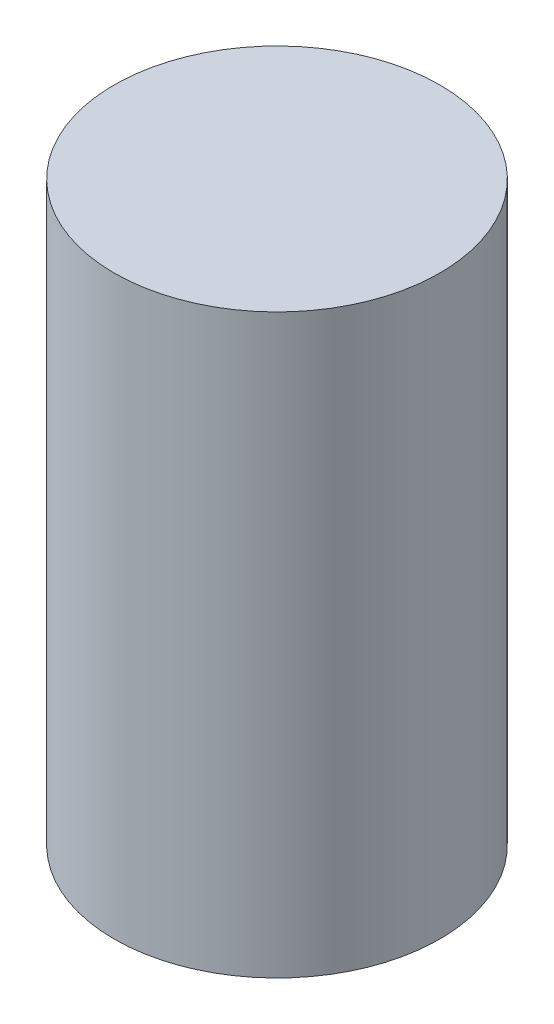
ISO-10303-21;
HEADER;
FILE_DESCRIPTION(('STEP AP214'),'2;1');
FILE_NAME('part.step','',(''),(''),'','','');
FILE_SCHEMA(('AUTOMOTIVE_DESIGN { 1 0 10303 214 1 1 1 1 }'));
ENDSEC;
DATA;
#1=APPLICATION_CONTEXT('core data for automotive mechanical design processes');
#2=APPLICATION_PROTOCOL_DEFINITION('international standard','automotive_design',2000,#1);
#3=PRODUCT_CONTEXT('',#1,'mechanical');
#4=PRODUCT('Part','Part','',(#3));
#5=PRODUCT_RELATED_PRODUCT_CATEGORY('part','',(#4));
#6=PRODUCT_DEFINITION_FORMATION('','',#4);
#7=PRODUCT_DEFINITION_CONTEXT('part definition',#1,'design');
#8=PRODUCT_DEFINITION('design','',#6,#7);
#9=PRODUCT_DEFINITION_SHAPE('','',#8);
#10=(LENGTH_UNIT() NAMED_UNIT(*) SI_UNIT(.MILLI.,.METRE.));
#11=(NAMED_UNIT(*) PLANE_ANGLE_UNIT() SI_UNIT($,.RADIAN.));
#12=(NAMED_UNIT(*) SI_UNIT($,.STERADIAN.) SOLID_ANGLE_UNIT());
#13=UNCERTAINTY_MEASURE_WITH_UNIT(LENGTH_MEASURE(1.E-05),#10,'distance_accuracy_value','');
#14=(GEOMETRIC_REPRESENTATION_CONTEXT(3) GLOBAL_UNCERTAINTY_ASSIGNED_CONTEXT((#13)) GLOBAL_UNIT_ASSIGNED_CONTEXT((#10,
#11,#12)) REPRESENTATION_CONTEXT('',''));
#15=CARTESIAN_POINT('',(0.,0.,0.));
#16=DIRECTION('',(0.,0.,1.));
#17=DIRECTION('',(1.,0.,0.));
#18=AXIS2_PLACEMENT_3D('',#15,#16,#17);
#19=CARTESIAN_POINT('',(0.,69.5,0.));
#20=DIRECTION('',(0.,-1.,0.));
#21=DIRECTION('',(0.,0.,-1.));
#22=AXIS2_PLACEMENT_3D('',#19,#20,#21);
#23=CYLINDRICAL_SURFACE('',#22,19.625);
#24=CARTESIAN_POINT('',(0.,69.5,0.));
#25=DIRECTION('',(0.,1.,0.));
#26=DIRECTION('',(0.,0.,1.));
#27=AXIS2_PLACEMENT_3D('',#24,#25,#26);
#28=CIRCLE('',#27,19.625);
#29=CARTESIAN_POINT('',(0.,69.5,19.625));
#30=VERTEX_POINT('',#29);
#31=EDGE_CURVE('E11',#30,#30,#28,.T.);
#32=ORIENTED_EDGE('',*,*,#31,.F.);
#33=EDGE_LOOP('',(#32));
#34=FACE_BOUND('',#33,.T.);
#35=CARTESIAN_POINT('',(0.,0.,0.));
#36=DIRECTION('',(0.,1.,0.));
#37=DIRECTION('',(0.,0.,1.));
#38=AXIS2_PLACEMENT_3D('',#35,#36,#37);
#39=CIRCLE('',#38,19.625);
#40=CARTESIAN_POINT('',(0.,0.,19.625));
#41=VERTEX_POINT('',#40);
#42=EDGE_CURVE('E41',#41,#41,#39,.T.);
#43=ORIENTED_EDGE('',*,*,#42,.T.);
#44=EDGE_LOOP('',(#43));
#45=FACE_BOUND('',#44,.T.);
#46=ADVANCED_FACE('F38',(#34,#45),#23,.T.);
#47=CARTESIAN_POINT('',(0.,69.5,0.));
#48=DIRECTION('',(0.,1.,0.));
#49=DIRECTION('',(0.,0.,1.));
#50=AXIS2_PLACEMENT_3D('',#47,#48,#49);
#51=PLANE('',#50);
#52=ORIENTED_EDGE('',*,*,#31,.T.);
#53=EDGE_LOOP('',(#52));
#54=FACE_BOUND('',#53,.T.);
#55=ADVANCED_FACE('F67',(#54),#51,.T.);
#56=CARTESIAN_POINT('',(0.,0.,0.));
#57=DIRECTION('',(0.,1.,0.));
#58=DIRECTION('',(0.,0.,1.));
#59=AXIS2_PLACEMENT_3D('',#56,#57,#58);
#60=PLANE('',#59);
#61=CARTESIAN_POINT('',(0.,0.,0.));
#62=DIRECTION('',(0.,-1.,0.));
#63=DIRECTION('',(0.,0.,-1.));
#64=AXIS2_PLACEMENT_3D('',#61,#62,#63);
#65=CIRCLE('',#64,2.09999999999999);
#66=CARTESIAN_POINT('',(0.,0.,-2.09999999999999));
#67=VERTEX_POINT('',#66);
#68=EDGE_CURVE('E57',#67,#67,#65,.T.);
#69=ORIENTED_EDGE('',*,*,#68,.F.);
#70=EDGE_LOOP('',(#69));
#71=FACE_BOUND('',#70,.T.);
#72=ORIENTED_EDGE('',*,*,#42,.F.);
#73=EDGE_LOOP('',(#72));
#74=FACE_BOUND('',#73,.T.);
#75=ADVANCED_FACE('F51',(#71,#74),#60,.F.);
#76=CARTESIAN_POINT('',(0.,14.,0.));
#77=DIRECTION('',(0.,-1.,0.));
#78=DIRECTION('',(0.,0.,-1.));
#79=AXIS2_PLACEMENT_3D('',#76,#77,#78);
#80=CONICAL_SURFACE('',#79,2.09999999999999,1.02974425867665);
#81=CARTESIAN_POINT('',(0.,15.2618072999579,0.));
#82=VERTEX_POINT('',#81);
#83=VERTEX_LOOP('',#82);
#84=FACE_BOUND('',#83,.T.);
#85=CARTESIAN_POINT('',(0.,14.,0.));
#86=DIRECTION('',(0.,-1.,0.));
#87=DIRECTION('',(0.,0.,-1.));
#88=AXIS2_PLACEMENT_3D('',#85,#86,#87);
#89=CIRCLE('',#88,2.09999999999999);
#90=CARTESIAN_POINT('',(0.,14.,-2.09999999999999));
#91=VERTEX_POINT('',#90);
#92=EDGE_CURVE('E55',#91,#91,#89,.T.);
#93=ORIENTED_EDGE('',*,*,#92,.T.);
#94=EDGE_LOOP('',(#93));
#95=FACE_BOUND('',#94,.T.);
#96=ADVANCED_FACE('F47',(#84,#95),#80,.F.);
#97=CARTESIAN_POINT('',(0.,0.,0.));
#98=DIRECTION('',(0.,-1.,0.));
#99=DIRECTION('',(0.,0.,-1.));
#100=AXIS2_PLACEMENT_3D('',#97,#98,#99);
#101=CYLINDRICAL_SURFACE('',#100,2.09999999999999);
#102=ORIENTED_EDGE('',*,*,#92,.F.);
#103=EDGE_LOOP('',(#102));
#104=FACE_BOUND('',#103,.T.);
#105=ORIENTED_EDGE('',*,*,#68,.T.);
#106=EDGE_LOOP('',(#105));
#107=FACE_BOUND('',#106,.T.);
#108=ADVANCED_FACE('F50',(#104,#107),#101,.F.);
#109=CLOSED_SHELL('',(#46,#55,#75,#96,#108));
#110=MANIFOLD_SOLID_BREP('B2',#109);
#111=ADVANCED_BREP_SHAPE_REPRESENTATION('',(#18,#110),#14);
#112=SHAPE_DEFINITION_REPRESENTATION(#9,#111);
ENDSEC;
END-ISO-10303-21;
